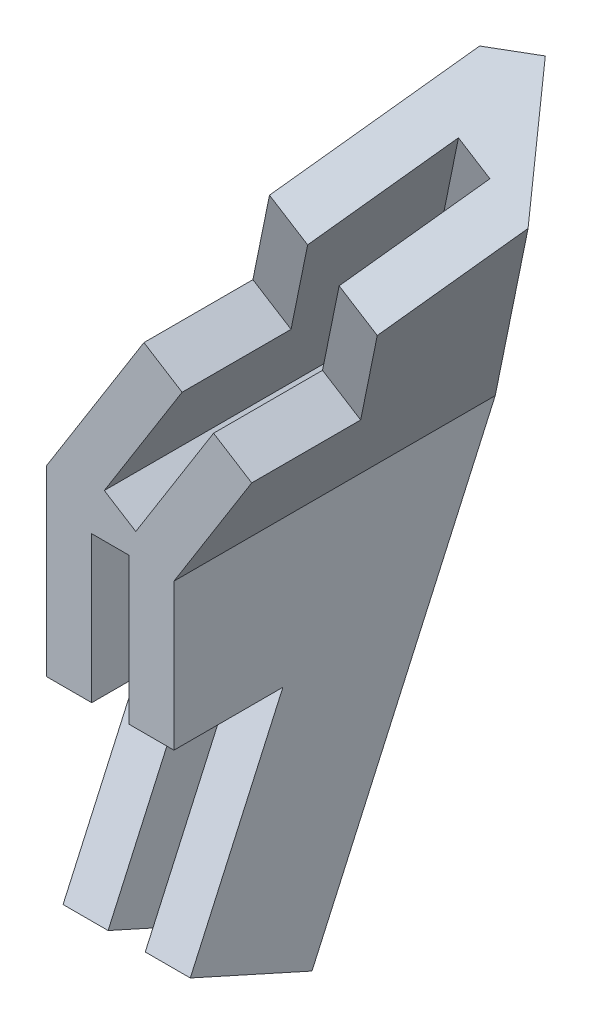
ISO-10303-21;
HEADER;
FILE_DESCRIPTION(('STEP AP214'),'2;1');
FILE_NAME('part.step','',(''),(''),'','','');
FILE_SCHEMA(('AUTOMOTIVE_DESIGN { 1 0 10303 214 1 1 1 1 }'));
ENDSEC;
DATA;
#1=APPLICATION_CONTEXT('core data for automotive mechanical design processes');
#2=APPLICATION_PROTOCOL_DEFINITION('international standard','automotive_design',2000,#1);
#3=PRODUCT_CONTEXT('',#1,'mechanical');
#4=PRODUCT('Part','Part','',(#3));
#5=PRODUCT_RELATED_PRODUCT_CATEGORY('part','',(#4));
#6=PRODUCT_DEFINITION_FORMATION('','',#4);
#7=PRODUCT_DEFINITION_CONTEXT('part definition',#1,'design');
#8=PRODUCT_DEFINITION('design','',#6,#7);
#9=PRODUCT_DEFINITION_SHAPE('','',#8);
#10=(LENGTH_UNIT() NAMED_UNIT(*) SI_UNIT(.MILLI.,.METRE.));
#11=(NAMED_UNIT(*) PLANE_ANGLE_UNIT() SI_UNIT($,.RADIAN.));
#12=(NAMED_UNIT(*) SI_UNIT($,.STERADIAN.) SOLID_ANGLE_UNIT());
#13=UNCERTAINTY_MEASURE_WITH_UNIT(LENGTH_MEASURE(1.E-05),#10,'distance_accuracy_value','');
#14=(GEOMETRIC_REPRESENTATION_CONTEXT(3) GLOBAL_UNCERTAINTY_ASSIGNED_CONTEXT((#13)) GLOBAL_UNIT_ASSIGNED_CONTEXT((#10,
#11,#12)) REPRESENTATION_CONTEXT('',''));
#15=CARTESIAN_POINT('',(0.,0.,0.));
#16=DIRECTION('',(0.,0.,1.));
#17=DIRECTION('',(1.,0.,0.));
#18=AXIS2_PLACEMENT_3D('',#15,#16,#17);
#19=CARTESIAN_POINT('',(-1.7,-15.,30.));
#20=DIRECTION('',(0.,1.,0.));
#21=DIRECTION('',(-1.,0.,0.));
#22=AXIS2_PLACEMENT_3D('',#19,#20,#21);
#23=PLANE('',#22);
#24=DIRECTION('',(-1.,0.,0.));
#25=VECTOR('',#24,1.);
#26=CARTESIAN_POINT('',(-1.7,-15.,20.3230812852325));
#27=LINE('',#26,#25);
#28=CARTESIAN_POINT('',(-1.7,-15.,20.3230812852325));
#29=VERTEX_POINT('',#28);
#30=CARTESIAN_POINT('',(-5.7,-15.,20.3230812852325));
#31=VERTEX_POINT('',#30);
#32=EDGE_CURVE('E376',#29,#31,#27,.T.);
#33=ORIENTED_EDGE('',*,*,#32,.F.);
#34=DIRECTION('',(0.,0.,-1.));
#35=VECTOR('',#34,1.);
#36=CARTESIAN_POINT('',(-1.7,-15.,30.));
#37=LINE('',#36,#35);
#38=CARTESIAN_POINT('',(-1.7,-15.,30.));
#39=VERTEX_POINT('',#38);
#40=EDGE_CURVE('E431',#39,#29,#37,.T.);
#41=ORIENTED_EDGE('',*,*,#40,.F.);
#42=DIRECTION('',(1.,0.,0.));
#43=VECTOR('',#42,1.);
#44=CARTESIAN_POINT('',(-1.7,-15.,30.));
#45=LINE('',#44,#43);
#46=CARTESIAN_POINT('',(-5.7,-15.,30.));
#47=VERTEX_POINT('',#46);
#48=EDGE_CURVE('E426',#47,#39,#45,.T.);
#49=ORIENTED_EDGE('',*,*,#48,.F.);
#50=DIRECTION('',(0.,0.,-1.));
#51=VECTOR('',#50,1.);
#52=CARTESIAN_POINT('',(-5.7,-15.,30.));
#53=LINE('',#52,#51);
#54=EDGE_CURVE('E435',#47,#31,#53,.T.);
#55=ORIENTED_EDGE('',*,*,#54,.T.);
#56=EDGE_LOOP('',(#33,#41,#49,#55));
#57=FACE_BOUND('',#56,.T.);
#58=ADVANCED_FACE('F39',(#57),#23,.F.);
#59=CARTESIAN_POINT('',(-9.,-15.,30.));
#60=DIRECTION('',(0.,1.,0.));
#61=DIRECTION('',(0.,0.,1.));
#62=AXIS2_PLACEMENT_3D('',#59,#60,#61);
#63=PLANE('',#62);
#64=DIRECTION('',(-1.,0.,0.));
#65=VECTOR('',#64,1.);
#66=CARTESIAN_POINT('',(-13.,-15.,20.3230812852325));
#67=LINE('',#66,#65);
#68=CARTESIAN_POINT('',(-9.,-15.,20.3230812852325));
#69=VERTEX_POINT('',#68);
#70=CARTESIAN_POINT('',(-13.,-15.,20.3230812852325));
#71=VERTEX_POINT('',#70);
#72=EDGE_CURVE('E386',#69,#71,#67,.T.);
#73=ORIENTED_EDGE('',*,*,#72,.F.);
#74=DIRECTION('',(0.,0.,-1.));
#75=VECTOR('',#74,1.);
#76=CARTESIAN_POINT('',(-9.,-15.,30.));
#77=LINE('',#76,#75);
#78=CARTESIAN_POINT('',(-9.,-15.,30.));
#79=VERTEX_POINT('',#78);
#80=EDGE_CURVE('E447',#79,#69,#77,.T.);
#81=ORIENTED_EDGE('',*,*,#80,.F.);
#82=DIRECTION('',(1.,0.,0.));
#83=VECTOR('',#82,1.);
#84=CARTESIAN_POINT('',(-9.,-15.,30.));
#85=LINE('',#84,#83);
#86=CARTESIAN_POINT('',(-13.,-15.,30.));
#87=VERTEX_POINT('',#86);
#88=EDGE_CURVE('E414',#87,#79,#85,.T.);
#89=ORIENTED_EDGE('',*,*,#88,.F.);
#90=DIRECTION('',(0.,0.,-1.));
#91=VECTOR('',#90,1.);
#92=CARTESIAN_POINT('',(-13.,-15.,30.));
#93=LINE('',#92,#91);
#94=EDGE_CURVE('E48',#87,#71,#93,.T.);
#95=ORIENTED_EDGE('',*,*,#94,.T.);
#96=EDGE_LOOP('',(#73,#81,#89,#95));
#97=FACE_BOUND('',#96,.T.);
#98=ADVANCED_FACE('F456',(#97),#63,.F.);
#99=CARTESIAN_POINT('',(-13.,-15.,30.));
#100=DIRECTION('',(1.,0.,0.));
#101=DIRECTION('',(0.,0.,-1.));
#102=AXIS2_PLACEMENT_3D('',#99,#100,#101);
#103=PLANE('',#102);
#104=DIRECTION('',(0.,0.,-1.));
#105=VECTOR('',#104,1.);
#106=CARTESIAN_POINT('',(-13.,1.25089745243292,30.));
#107=LINE('',#106,#105);
#108=CARTESIAN_POINT('',(-13.,1.25089745243292,30.));
#109=VERTEX_POINT('',#108);
#110=CARTESIAN_POINT('',(-13.,1.25089745243292,-5.11465509772061));
#111=VERTEX_POINT('',#110);
#112=EDGE_CURVE('E338',#109,#111,#107,.T.);
#113=ORIENTED_EDGE('',*,*,#112,.T.);
#114=DIRECTION('',(0.,-0.911707711386247,0.410839444307446));
#115=VECTOR('',#114,1.);
#116=CARTESIAN_POINT('',(-13.,8.19716535013695,-8.24482588322837));
#117=LINE('',#116,#115);
#118=CARTESIAN_POINT('',(-13.,-40.0344146004353,13.4895910329497));
#119=VERTEX_POINT('',#118);
#120=EDGE_CURVE('E347',#111,#119,#117,.T.);
#121=ORIENTED_EDGE('',*,*,#120,.T.);
#122=DIRECTION('',(0.,-0.410839444307446,-0.911707711386248));
#123=VECTOR('',#122,1.);
#124=CARTESIAN_POINT('',(-13.,-42.3512313415874,8.34826461445588));
#125=LINE('',#124,#123);
#126=CARTESIAN_POINT('',(-13.,-33.2492899463306,28.5466907237838));
#127=VERTEX_POINT('',#126);
#128=EDGE_CURVE('E351',#127,#119,#125,.T.);
#129=ORIENTED_EDGE('',*,*,#128,.F.);
#130=DIRECTION('',(0.,0.911707711386247,-0.410839444307446));
#131=VECTOR('',#130,1.);
#132=CARTESIAN_POINT('',(-13.,-42.3512313415874,32.6482646144559));
#133=LINE('',#132,#131);
#134=EDGE_CURVE('E390',#127,#71,#133,.T.);
#135=ORIENTED_EDGE('',*,*,#134,.T.);
#136=ORIENTED_EDGE('',*,*,#94,.F.);
#137=DIRECTION('',(0.,-1.,0.));
#138=VECTOR('',#137,1.);
#139=CARTESIAN_POINT('',(-13.,-15.,30.));
#140=LINE('',#139,#138);
#141=EDGE_CURVE('E411',#109,#87,#140,.T.);
#142=ORIENTED_EDGE('',*,*,#141,.F.);
#143=EDGE_LOOP('',(#113,#121,#129,#135,#136,#142));
#144=FACE_BOUND('',#143,.T.);
#145=ADVANCED_FACE('F41',(#144),#103,.F.);
#146=CARTESIAN_POINT('',(-9.00000000000004,-1.99999999999999,30.));
#147=DIRECTION('',(-1.,0.,0.));
#148=DIRECTION('',(0.,-1.,0.));
#149=AXIS2_PLACEMENT_3D('',#146,#147,#148);
#150=PLANE('',#149);
#151=DIRECTION('',(0.,0.911707711386247,-0.410839444307446));
#152=VECTOR('',#151,1.);
#153=CARTESIAN_POINT('',(-9.,-42.3512313415874,32.6482646144559));
#154=LINE('',#153,#152);
#155=CARTESIAN_POINT('',(-9.,-33.2492899463306,28.5466907237838));
#156=VERTEX_POINT('',#155);
#157=EDGE_CURVE('E393',#156,#69,#154,.T.);
#158=ORIENTED_EDGE('',*,*,#157,.F.);
#159=DIRECTION('',(0.,-0.410839444307446,-0.911707711386248));
#160=VECTOR('',#159,1.);
#161=CARTESIAN_POINT('',(-8.99999999999995,-27.430392513935,41.4596028951641));
#162=LINE('',#161,#160);
#163=CARTESIAN_POINT('',(-9.00000000000004,-38.1186413100483,17.7409483607689));
#164=VERTEX_POINT('',#163);
#165=EDGE_CURVE('E372',#156,#164,#162,.T.);
#166=ORIENTED_EDGE('',*,*,#165,.T.);
#167=DIRECTION('',(0.,0.911707711386248,-0.410839444307446));
#168=VECTOR('',#167,1.);
#169=CARTESIAN_POINT('',(-9.00000000000001,-12.6882487961132,6.28134546560477));
#170=LINE('',#169,#168);
#171=CARTESIAN_POINT('',(-9.00000000000004,-1.99999999999999,1.46493978955959));
#172=VERTEX_POINT('',#171);
#173=EDGE_CURVE('E408',#164,#172,#170,.T.);
#174=ORIENTED_EDGE('',*,*,#173,.T.);
#175=DIRECTION('',(0.,0.,-1.));
#176=VECTOR('',#175,1.);
#177=CARTESIAN_POINT('',(-9.00000000000004,-1.99999999999999,30.));
#178=LINE('',#177,#176);
#179=CARTESIAN_POINT('',(-9.00000000000004,-1.99999999999999,30.));
#180=VERTEX_POINT('',#179);
#181=EDGE_CURVE('E443',#180,#172,#178,.T.);
#182=ORIENTED_EDGE('',*,*,#181,.F.);
#183=DIRECTION('',(0.,1.,0.));
#184=VECTOR('',#183,1.);
#185=CARTESIAN_POINT('',(-9.00000000000004,-1.99999999999999,30.));
#186=LINE('',#185,#184);
#187=EDGE_CURVE('E417',#79,#180,#186,.T.);
#188=ORIENTED_EDGE('',*,*,#187,.F.);
#189=ORIENTED_EDGE('',*,*,#80,.T.);
#190=EDGE_LOOP('',(#158,#166,#174,#182,#188,#189));
#191=FACE_BOUND('',#190,.T.);
#192=ADVANCED_FACE('F467',(#191),#150,.F.);
#193=CARTESIAN_POINT('',(-5.7,-1.99999999999999,30.));
#194=DIRECTION('',(0.,1.,0.));
#195=DIRECTION('',(-1.,0.,0.));
#196=AXIS2_PLACEMENT_3D('',#193,#194,#195);
#197=PLANE('',#196);
#198=ORIENTED_EDGE('',*,*,#181,.T.);
#199=DIRECTION('',(1.,0.,0.));
#200=VECTOR('',#199,1.);
#201=CARTESIAN_POINT('',(-5.7,-1.99999999999999,1.46493978955959));
#202=LINE('',#201,#200);
#203=CARTESIAN_POINT('',(-5.7,-1.99999999999998,1.46493978955959));
#204=VERTEX_POINT('',#203);
#205=EDGE_CURVE('E404',#172,#204,#202,.T.);
#206=ORIENTED_EDGE('',*,*,#205,.T.);
#207=DIRECTION('',(0.,0.,-1.));
#208=VECTOR('',#207,1.);
#209=CARTESIAN_POINT('',(-5.7,-1.99999999999999,30.));
#210=LINE('',#209,#208);
#211=CARTESIAN_POINT('',(-5.7,-1.99999999999999,30.));
#212=VERTEX_POINT('',#211);
#213=EDGE_CURVE('E439',#212,#204,#210,.T.);
#214=ORIENTED_EDGE('',*,*,#213,.F.);
#215=DIRECTION('',(1.,0.,0.));
#216=VECTOR('',#215,1.);
#217=CARTESIAN_POINT('',(-5.7,-1.99999999999999,30.));
#218=LINE('',#217,#216);
#219=EDGE_CURVE('E420',#180,#212,#218,.T.);
#220=ORIENTED_EDGE('',*,*,#219,.F.);
#221=EDGE_LOOP('',(#198,#206,#214,#220));
#222=FACE_BOUND('',#221,.T.);
#223=ADVANCED_FACE('F533',(#222),#197,.F.);
#224=CARTESIAN_POINT('',(-5.7,-15.,30.));
#225=DIRECTION('',(1.,0.,0.));
#226=DIRECTION('',(0.,0.,-1.));
#227=AXIS2_PLACEMENT_3D('',#224,#225,#226);
#228=PLANE('',#227);
#229=DIRECTION('',(0.,-0.911707711386248,0.410839444307446));
#230=VECTOR('',#229,1.);
#231=CARTESIAN_POINT('',(-5.7,-23.4939911591282,11.1506968293224));
#232=LINE('',#231,#230);
#233=CARTESIAN_POINT('',(-5.7,-38.1186413100483,17.7409483607689));
#234=VERTEX_POINT('',#233);
#235=EDGE_CURVE('E400',#204,#234,#232,.T.);
#236=ORIENTED_EDGE('',*,*,#235,.T.);
#237=DIRECTION('',(0.,0.410839444307446,0.911707711386248));
#238=VECTOR('',#237,1.);
#239=CARTESIAN_POINT('',(-5.7,-29.6246501509201,36.5902515314465));
#240=LINE('',#239,#238);
#241=CARTESIAN_POINT('',(-5.7,-33.2492899463306,28.5466907237838));
#242=VERTEX_POINT('',#241);
#243=EDGE_CURVE('E368',#234,#242,#240,.T.);
#244=ORIENTED_EDGE('',*,*,#243,.T.);
#245=DIRECTION('',(0.,0.911707711386247,-0.410839444307446));
#246=VECTOR('',#245,1.);
#247=CARTESIAN_POINT('',(-5.7,-42.3512313415874,32.6482646144559));
#248=LINE('',#247,#246);
#249=EDGE_CURVE('E380',#242,#31,#248,.T.);
#250=ORIENTED_EDGE('',*,*,#249,.T.);
#251=ORIENTED_EDGE('',*,*,#54,.F.);
#252=DIRECTION('',(0.,-1.,0.));
#253=VECTOR('',#252,1.);
#254=CARTESIAN_POINT('',(-5.7,-15.,30.));
#255=LINE('',#254,#253);
#256=EDGE_CURVE('E423',#212,#47,#255,.T.);
#257=ORIENTED_EDGE('',*,*,#256,.F.);
#258=ORIENTED_EDGE('',*,*,#213,.T.);
#259=EDGE_LOOP('',(#236,#244,#250,#251,#257,#258));
#260=FACE_BOUND('',#259,.T.);
#261=ADVANCED_FACE('F525',(#260),#228,.F.);
#262=CARTESIAN_POINT('',(-1.7,-2.,30.));
#263=DIRECTION('',(-1.,0.,0.));
#264=DIRECTION('',(0.,0.,1.));
#265=AXIS2_PLACEMENT_3D('',#262,#263,#264);
#266=PLANE('',#265);
#267=DIRECTION('',(0.,0.911707711386247,-0.410839444307446));
#268=VECTOR('',#267,1.);
#269=CARTESIAN_POINT('',(-1.7,-42.3512313415874,32.6482646144559));
#270=LINE('',#269,#268);
#271=CARTESIAN_POINT('',(-1.7,-33.2492899463306,28.5466907237838));
#272=VERTEX_POINT('',#271);
#273=EDGE_CURVE('E383',#272,#29,#270,.T.);
#274=ORIENTED_EDGE('',*,*,#273,.F.);
#275=DIRECTION('',(0.,-0.410839444307446,-0.911707711386248));
#276=VECTOR('',#275,1.);
#277=CARTESIAN_POINT('',(-1.7,-42.3512313415874,8.34826461445588));
#278=LINE('',#277,#276);
#279=CARTESIAN_POINT('',(-1.7,-38.1186413100482,17.7409483607689));
#280=VERTEX_POINT('',#279);
#281=EDGE_CURVE('E354',#272,#280,#278,.T.);
#282=ORIENTED_EDGE('',*,*,#281,.T.);
#283=DIRECTION('',(0.,0.911707711386248,-0.410839444307446));
#284=VECTOR('',#283,1.);
#285=CARTESIAN_POINT('',(-1.7,1.25089745243292,0.));
#286=LINE('',#285,#284);
#287=CARTESIAN_POINT('',(-1.7,-2.00000000000001,1.4649397895596));
#288=VERTEX_POINT('',#287);
#289=EDGE_CURVE('E396',#280,#288,#286,.T.);
#290=ORIENTED_EDGE('',*,*,#289,.T.);
#291=DIRECTION('',(0.,0.,-1.));
#292=VECTOR('',#291,1.);
#293=CARTESIAN_POINT('',(-1.7,-2.00000000000001,30.));
#294=LINE('',#293,#292);
#295=CARTESIAN_POINT('',(-1.7,-2.,30.));
#296=VERTEX_POINT('',#295);
#297=EDGE_CURVE('E311',#296,#288,#294,.T.);
#298=ORIENTED_EDGE('',*,*,#297,.F.);
#299=DIRECTION('',(0.,1.,0.));
#300=VECTOR('',#299,1.);
#301=CARTESIAN_POINT('',(-1.7,-2.,30.));
#302=LINE('',#301,#300);
#303=EDGE_CURVE('E63',#39,#296,#302,.T.);
#304=ORIENTED_EDGE('',*,*,#303,.F.);
#305=ORIENTED_EDGE('',*,*,#40,.T.);
#306=EDGE_LOOP('',(#274,#282,#290,#298,#304,#305));
#307=FACE_BOUND('',#306,.T.);
#308=ADVANCED_FACE('F517',(#307),#266,.F.);
#309=CARTESIAN_POINT('',(0.,0.,30.));
#310=DIRECTION('',(0.,0.,-1.));
#311=DIRECTION('',(-1.,0.,0.));
#312=AXIS2_PLACEMENT_3D('',#309,#310,#311);
#313=PLANE('',#312);
#314=ORIENTED_EDGE('',*,*,#303,.T.);
#315=DIRECTION('',(-0.531398579518072,-0.847121921382144,0.));
#316=VECTOR('',#315,1.);
#317=CARTESIAN_POINT('',(-1.7,-2.00000000000001,30.));
#318=LINE('',#317,#316);
#319=CARTESIAN_POINT('',(5.20818153373493,9.01258497796785,30.));
#320=VERTEX_POINT('',#319);
#321=EDGE_CURVE('E307',#320,#296,#318,.T.);
#322=ORIENTED_EDGE('',*,*,#321,.F.);
#323=DIRECTION('',(0.847121921382144,-0.531398579518072,0.));
#324=VECTOR('',#323,1.);
#325=CARTESIAN_POINT('',(5.20818153373493,9.01258497796785,30.));
#326=LINE('',#325,#324);
#327=CARTESIAN_POINT('',(1.81969384820635,11.1381792960401,30.));
#328=VERTEX_POINT('',#327);
#329=EDGE_CURVE('E303',#328,#320,#326,.T.);
#330=ORIENTED_EDGE('',*,*,#329,.F.);
#331=DIRECTION('',(0.531398579518072,0.847121921382144,0.));
#332=VECTOR('',#331,1.);
#333=CARTESIAN_POINT('',(1.81969384820635,11.1381792960401,30.));
#334=LINE('',#333,#332);
#335=CARTESIAN_POINT('',(-5.08848768552858,0.12559431807227,30.));
#336=VERTEX_POINT('',#335);
#337=EDGE_CURVE('E300',#336,#328,#334,.T.);
#338=ORIENTED_EDGE('',*,*,#337,.F.);
#339=DIRECTION('',(0.847121921382144,-0.531398579518072,0.));
#340=VECTOR('',#339,1.);
#341=CARTESIAN_POINT('',(-5.08848768552858,0.12559431807227,30.));
#342=LINE('',#341,#340);
#343=CARTESIAN_POINT('',(-7.88399002608969,1.87920963048193,30.));
#344=VERTEX_POINT('',#343);
#345=EDGE_CURVE('E296',#344,#336,#342,.T.);
#346=ORIENTED_EDGE('',*,*,#345,.F.);
#347=DIRECTION('',(-0.531398579518075,-0.847121921382142,0.));
#348=VECTOR('',#347,1.);
#349=CARTESIAN_POINT('',(-7.88399002608969,1.87920963048193,30.));
#350=LINE('',#349,#348);
#351=CARTESIAN_POINT('',(-0.97580849235472,12.8917946084498,30.));
#352=VERTEX_POINT('',#351);
#353=EDGE_CURVE('E292',#352,#344,#350,.T.);
#354=ORIENTED_EDGE('',*,*,#353,.F.);
#355=DIRECTION('',(0.847121921382144,-0.531398579518072,0.));
#356=VECTOR('',#355,1.);
#357=CARTESIAN_POINT('',(-0.97580849235472,12.8917946084498,30.));
#358=LINE('',#357,#356);
#359=CARTESIAN_POINT('',(-4.3642961778833,15.0173889265221,30.));
#360=VERTEX_POINT('',#359);
#361=EDGE_CURVE('E288',#360,#352,#358,.T.);
#362=ORIENTED_EDGE('',*,*,#361,.F.);
#363=DIRECTION('',(0.531398579518072,0.847121921382144,0.));
#364=VECTOR('',#363,1.);
#365=CARTESIAN_POINT('',(-4.3642961778833,15.0173889265221,30.));
#366=LINE('',#365,#364);
#367=EDGE_CURVE('E285',#109,#360,#366,.T.);
#368=ORIENTED_EDGE('',*,*,#367,.F.);
#369=ORIENTED_EDGE('',*,*,#141,.T.);
#370=ORIENTED_EDGE('',*,*,#88,.T.);
#371=ORIENTED_EDGE('',*,*,#187,.T.);
#372=ORIENTED_EDGE('',*,*,#219,.T.);
#373=ORIENTED_EDGE('',*,*,#256,.T.);
#374=ORIENTED_EDGE('',*,*,#48,.T.);
#375=EDGE_LOOP('',(#314,#322,#330,#338,#346,#354,#362,#368,#369,#370,#371,#372,#373,#374));
#376=FACE_BOUND('',#375,.T.);
#377=ADVANCED_FACE('F472',(#376),#313,.F.);
#378=CARTESIAN_POINT('',(-13.,-42.3512313415874,32.6482646144559));
#379=DIRECTION('',(0.,-0.410839444307446,-0.911707711386247));
#380=DIRECTION('',(0.,0.911707711386248,-0.410839444307446));
#381=AXIS2_PLACEMENT_3D('',#378,#379,#380);
#382=PLANE('',#381);
#383=ORIENTED_EDGE('',*,*,#134,.F.);
#384=DIRECTION('',(-1.,0.,0.));
#385=VECTOR('',#384,1.);
#386=CARTESIAN_POINT('',(-1.7,-33.2492899463306,28.5466907237838));
#387=LINE('',#386,#385);
#388=EDGE_CURVE('E358',#156,#127,#387,.T.);
#389=ORIENTED_EDGE('',*,*,#388,.F.);
#390=ORIENTED_EDGE('',*,*,#157,.T.);
#391=ORIENTED_EDGE('',*,*,#72,.T.);
#392=EDGE_LOOP('',(#383,#389,#390,#391));
#393=FACE_BOUND('',#392,.T.);
#394=ADVANCED_FACE('F464',(#393),#382,.F.);
#395=CARTESIAN_POINT('',(-1.7,-42.3512313415874,32.6482646144559));
#396=DIRECTION('',(0.,-0.410839444307446,-0.911707711386247));
#397=DIRECTION('',(0.,0.911707711386248,-0.410839444307446));
#398=AXIS2_PLACEMENT_3D('',#395,#396,#397);
#399=PLANE('',#398);
#400=ORIENTED_EDGE('',*,*,#249,.F.);
#401=EDGE_CURVE('E362',#272,#242,#387,.T.);
#402=ORIENTED_EDGE('',*,*,#401,.F.);
#403=ORIENTED_EDGE('',*,*,#273,.T.);
#404=ORIENTED_EDGE('',*,*,#32,.T.);
#405=EDGE_LOOP('',(#400,#402,#403,#404));
#406=FACE_BOUND('',#405,.T.);
#407=ADVANCED_FACE('F521',(#406),#399,.F.);
#408=CARTESIAN_POINT('',(-1.7,15.2246680695878,-6.2969481156439));
#409=DIRECTION('',(0.,0.410839444307446,0.911707711386248));
#410=DIRECTION('',(0.,-0.911707711386247,0.410839444307446));
#411=AXIS2_PLACEMENT_3D('',#408,#409,#410);
#412=PLANE('',#411);
#413=DIRECTION('',(-1.,0.,0.));
#414=VECTOR('',#413,1.);
#415=CARTESIAN_POINT('',(-1.7,-38.1186413100483,17.7409483607689));
#416=LINE('',#415,#414);
#417=EDGE_CURVE('E365',#234,#164,#416,.T.);
#418=ORIENTED_EDGE('',*,*,#417,.F.);
#419=ORIENTED_EDGE('',*,*,#235,.F.);
#420=ORIENTED_EDGE('',*,*,#205,.F.);
#421=ORIENTED_EDGE('',*,*,#173,.F.);
#422=EDGE_LOOP('',(#418,#419,#420,#421));
#423=FACE_BOUND('',#422,.T.);
#424=ADVANCED_FACE('F530',(#423),#412,.T.);
#425=CARTESIAN_POINT('',(-1.7,15.2246680695878,-6.2969481156439));
#426=DIRECTION('',(0.673730858796115,-0.303600823140683,-0.673730858796113));
#427=DIRECTION('',(-0.707106781186546,0.,-0.707106781186549));
#428=AXIS2_PLACEMENT_3D('',#425,#426,#427);
#429=PLANE('',#428);
#430=DIRECTION('',(0.,-0.911707711386247,0.410839444307446));
#431=VECTOR('',#430,1.);
#432=CARTESIAN_POINT('',(-10.0504379850208,6.98515274898547,-10.9344440542144));
#433=LINE('',#432,#431);
#434=CARTESIAN_POINT('',(-10.0504379850208,0.402337838248064,-7.96805473214323));
#435=VERTEX_POINT('',#434);
#436=CARTESIAN_POINT('',(-10.0504379850208,-41.2464272015867,10.7999728619636));
#437=VERTEX_POINT('',#436);
#438=EDGE_CURVE('E55',#435,#437,#433,.T.);
#439=ORIENTED_EDGE('',*,*,#438,.F.);
#440=DIRECTION('',(-0.651102708453991,0.187315764264182,-0.735512112410124));
#441=VECTOR('',#440,1.);
#442=CARTESIAN_POINT('',(-7.51787253854932,-0.326256016446955,-5.1071657553886));
#443=LINE('',#442,#441);
#444=EDGE_CURVE('E246',#288,#435,#443,.T.);
#445=ORIENTED_EDGE('',*,*,#444,.F.);
#446=ORIENTED_EDGE('',*,*,#289,.F.);
#447=DIRECTION('',(0.738976812833697,0.276795211640574,0.614245619363298));
#448=VECTOR('',#447,1.);
#449=CARTESIAN_POINT('',(-1.7,-38.1186413100483,17.7409483607689));
#450=LINE('',#449,#448);
#451=EDGE_CURVE('E11',#437,#280,#450,.T.);
#452=ORIENTED_EDGE('',*,*,#451,.F.);
#453=EDGE_LOOP('',(#439,#445,#446,#452));
#454=FACE_BOUND('',#453,.T.);
#455=ADVANCED_FACE('F514',(#454),#429,.T.);
#456=CARTESIAN_POINT('',(-1.7,-42.3512313415874,8.34826461445588));
#457=DIRECTION('',(0.,0.911707711386247,-0.410839444307446));
#458=DIRECTION('',(0.,0.410839444307446,0.911707711386248));
#459=AXIS2_PLACEMENT_3D('',#456,#457,#458);
#460=PLANE('',#459);
#461=ORIENTED_EDGE('',*,*,#128,.T.);
#462=DIRECTION('',(-0.707043710808464,0.290533266536796,0.644732201802932));
#463=VECTOR('',#462,1.);
#464=CARTESIAN_POINT('',(-8.57573568978878,-41.8524011582933,9.45523555184516));
#465=LINE('',#464,#463);
#466=EDGE_CURVE('E344',#437,#119,#465,.T.);
#467=ORIENTED_EDGE('',*,*,#466,.F.);
#468=ORIENTED_EDGE('',*,*,#451,.T.);
#469=ORIENTED_EDGE('',*,*,#281,.F.);
#470=ORIENTED_EDGE('',*,*,#401,.T.);
#471=ORIENTED_EDGE('',*,*,#243,.F.);
#472=ORIENTED_EDGE('',*,*,#417,.T.);
#473=ORIENTED_EDGE('',*,*,#165,.F.);
#474=ORIENTED_EDGE('',*,*,#388,.T.);
#475=EDGE_LOOP('',(#461,#467,#468,#469,#470,#471,#472,#473,#474));
#476=FACE_BOUND('',#475,.T.);
#477=ADVANCED_FACE('F477',(#476),#460,.F.);
#478=CARTESIAN_POINT('',(-8.57573568978878,6.37917879227894,-12.2791813643329));
#479=DIRECTION('',(0.707169845939572,0.290481445249624,0.644617203431224));
#480=DIRECTION('',(0.67366522717444,0.,-0.73903664435264));
#481=AXIS2_PLACEMENT_3D('',#478,#479,#480);
#482=PLANE('',#481);
#483=DIRECTION('',(0.703837316885534,-0.202486985875257,-0.680890631386955));
#484=VECTOR('',#483,1.);
#485=CARTESIAN_POINT('',(-8.10564839167238,-0.15715875772843,-9.84943979423298));
#486=LINE('',#485,#484);
#487=EDGE_CURVE('E215',#111,#435,#486,.T.);
#488=ORIENTED_EDGE('',*,*,#487,.T.);
#489=ORIENTED_EDGE('',*,*,#438,.T.);
#490=ORIENTED_EDGE('',*,*,#466,.T.);
#491=ORIENTED_EDGE('',*,*,#120,.F.);
#492=EDGE_LOOP('',(#488,#489,#490,#491));
#493=FACE_BOUND('',#492,.T.);
#494=ADVANCED_FACE('F621',(#493),#482,.F.);
#495=CARTESIAN_POINT('',(5.20818153373493,9.01258497796785,30.));
#496=DIRECTION('',(-0.531398579518072,-0.847121921382144,0.));
#497=DIRECTION('',(-0.847121921382144,0.531398579518072,0.));
#498=AXIS2_PLACEMENT_3D('',#495,#496,#497);
#499=PLANE('',#498);
#500=DIRECTION('',(-0.847121921382144,0.531398579518072,0.));
#501=VECTOR('',#500,1.);
#502=CARTESIAN_POINT('',(5.20818153373493,9.01258497796785,20.3230812852325));
#503=LINE('',#502,#501);
#504=CARTESIAN_POINT('',(5.20818153373493,9.01258497796785,20.3230812852325));
#505=VERTEX_POINT('',#504);
#506=CARTESIAN_POINT('',(1.81969384820635,11.1381792960401,20.3230812852325));
#507=VERTEX_POINT('',#506);
#508=EDGE_CURVE('E250',#505,#507,#503,.T.);
#509=ORIENTED_EDGE('',*,*,#508,.T.);
#510=DIRECTION('',(0.,0.,-1.));
#511=VECTOR('',#510,1.);
#512=CARTESIAN_POINT('',(1.81969384820635,11.1381792960401,30.));
#513=LINE('',#512,#511);
#514=EDGE_CURVE('E319',#328,#507,#513,.T.);
#515=ORIENTED_EDGE('',*,*,#514,.F.);
#516=ORIENTED_EDGE('',*,*,#329,.T.);
#517=DIRECTION('',(0.,0.,-1.));
#518=VECTOR('',#517,1.);
#519=CARTESIAN_POINT('',(5.20818153373493,9.01258497796785,30.));
#520=LINE('',#519,#518);
#521=EDGE_CURVE('E315',#320,#505,#520,.T.);
#522=ORIENTED_EDGE('',*,*,#521,.T.);
#523=EDGE_LOOP('',(#509,#515,#516,#522));
#524=FACE_BOUND('',#523,.T.);
#525=ADVANCED_FACE('F629',(#524),#499,.F.);
#526=CARTESIAN_POINT('',(-0.97580849235472,12.8917946084498,30.));
#527=DIRECTION('',(-0.531398579518072,-0.847121921382144,0.));
#528=DIRECTION('',(0.,0.,1.));
#529=AXIS2_PLACEMENT_3D('',#526,#527,#528);
#530=PLANE('',#529);
#531=DIRECTION('',(-0.847121921382144,0.531398579518072,0.));
#532=VECTOR('',#531,1.);
#533=CARTESIAN_POINT('',(-4.3642961778833,15.0173889265221,20.3230812852325));
#534=LINE('',#533,#532);
#535=CARTESIAN_POINT('',(-0.97580849235472,12.8917946084498,20.3230812852325));
#536=VERTEX_POINT('',#535);
#537=CARTESIAN_POINT('',(-4.3642961778833,15.0173889265221,20.3230812852325));
#538=VERTEX_POINT('',#537);
#539=EDGE_CURVE('E260',#536,#538,#534,.T.);
#540=ORIENTED_EDGE('',*,*,#539,.T.);
#541=DIRECTION('',(0.,0.,-1.));
#542=VECTOR('',#541,1.);
#543=CARTESIAN_POINT('',(-4.3642961778833,15.0173889265221,30.));
#544=LINE('',#543,#542);
#545=EDGE_CURVE('E335',#360,#538,#544,.T.);
#546=ORIENTED_EDGE('',*,*,#545,.F.);
#547=ORIENTED_EDGE('',*,*,#361,.T.);
#548=DIRECTION('',(0.,0.,-1.));
#549=VECTOR('',#548,1.);
#550=CARTESIAN_POINT('',(-0.97580849235472,12.8917946084498,30.));
#551=LINE('',#550,#549);
#552=EDGE_CURVE('E331',#352,#536,#551,.T.);
#553=ORIENTED_EDGE('',*,*,#552,.T.);
#554=EDGE_LOOP('',(#540,#546,#547,#553));
#555=FACE_BOUND('',#554,.T.);
#556=ADVANCED_FACE('F644',(#555),#530,.F.);
#557=CARTESIAN_POINT('',(-4.3642961778833,15.0173889265221,30.));
#558=DIRECTION('',(0.847121921382144,-0.531398579518072,0.));
#559=DIRECTION('',(0.,0.,-1.));
#560=AXIS2_PLACEMENT_3D('',#557,#558,#559);
#561=PLANE('',#560);
#562=ORIENTED_EDGE('',*,*,#112,.F.);
#563=ORIENTED_EDGE('',*,*,#367,.T.);
#564=ORIENTED_EDGE('',*,*,#545,.T.);
#565=DIRECTION('',(-0.484480182766324,-0.772327588208435,-0.410839444307446));
#566=VECTOR('',#565,1.);
#567=CARTESIAN_POINT('',(10.1701093051064,38.1872165727751,32.6482646144559));
#568=LINE('',#567,#566);
#569=CARTESIAN_POINT('',(5.33335057681025,30.4767624897175,28.5466907237838));
#570=VERTEX_POINT('',#569);
#571=EDGE_CURVE('E222',#570,#538,#568,.T.);
#572=ORIENTED_EDGE('',*,*,#571,.F.);
#573=DIRECTION('',(0.218319497114971,0.348031099441296,-0.911707711386248));
#574=VECTOR('',#573,1.);
#575=CARTESIAN_POINT('',(10.1701093051064,38.1872165727751,8.34826461445588));
#576=LINE('',#575,#574);
#577=CARTESIAN_POINT('',(8.93895617985451,36.22459032352,13.4895910329497));
#578=VERTEX_POINT('',#577);
#579=EDGE_CURVE('E201',#570,#578,#576,.T.);
#580=ORIENTED_EDGE('',*,*,#579,.T.);
#581=DIRECTION('',(0.484480182766324,0.772327588208435,0.410839444307446));
#582=VECTOR('',#581,1.);
#583=CARTESIAN_POINT('',(-16.6912368937919,-4.63343835550523,-8.24482588322837));
#584=LINE('',#583,#582);
#585=EDGE_CURVE('E213',#111,#578,#584,.T.);
#586=ORIENTED_EDGE('',*,*,#585,.F.);
#587=EDGE_LOOP('',(#562,#563,#564,#572,#580,#586));
#588=FACE_BOUND('',#587,.T.);
#589=ADVANCED_FACE('F220',(#588),#561,.F.);
#590=CARTESIAN_POINT('',(-7.88399002608969,1.87920963048193,30.));
#591=DIRECTION('',(-0.847121921382142,0.531398579518075,0.));
#592=DIRECTION('',(0.531398579518075,0.847121921382142,0.));
#593=AXIS2_PLACEMENT_3D('',#590,#591,#592);
#594=PLANE('',#593);
#595=DIRECTION('',(-0.484480182766324,-0.772327588208435,-0.410839444307446));
#596=VECTOR('',#595,1.);
#597=CARTESIAN_POINT('',(13.558596990635,36.0616222547028,32.6482646144559));
#598=LINE('',#597,#596);
#599=CARTESIAN_POINT('',(8.72183826233882,28.3511681716452,28.5466907237838));
#600=VERTEX_POINT('',#599);
#601=EDGE_CURVE('E266',#600,#536,#598,.T.);
#602=ORIENTED_EDGE('',*,*,#601,.T.);
#603=ORIENTED_EDGE('',*,*,#552,.F.);
#604=ORIENTED_EDGE('',*,*,#353,.T.);
#605=DIRECTION('',(0.,0.,-1.));
#606=VECTOR('',#605,1.);
#607=CARTESIAN_POINT('',(-7.88399002608969,1.87920963048193,30.));
#608=LINE('',#607,#606);
#609=CARTESIAN_POINT('',(-7.88399002608969,1.87920963048193,1.46493978955959));
#610=VERTEX_POINT('',#609);
#611=EDGE_CURVE('E327',#344,#610,#608,.T.);
#612=ORIENTED_EDGE('',*,*,#611,.T.);
#613=DIRECTION('',(-0.484480182766327,-0.772327588208434,-0.410839444307446));
#614=VECTOR('',#613,1.);
#615=CARTESIAN_POINT('',(-2.20426979829935,10.9334594868557,6.28134546560477));
#616=LINE('',#615,#614);
#617=CARTESIAN_POINT('',(11.3094046601927,32.4761024547625,17.7409483607689));
#618=VERTEX_POINT('',#617);
#619=EDGE_CURVE('E281',#618,#610,#616,.T.);
#620=ORIENTED_EDGE('',*,*,#619,.F.);
#621=DIRECTION('',(0.218319497114972,0.348031099441295,-0.911707711386248));
#622=VECTOR('',#621,1.);
#623=CARTESIAN_POINT('',(5.62968443240247,23.4218525983886,41.4596028951641));
#624=LINE('',#623,#622);
#625=EDGE_CURVE('E242',#600,#618,#624,.T.);
#626=ORIENTED_EDGE('',*,*,#625,.F.);
#627=EDGE_LOOP('',(#602,#603,#604,#612,#620,#626));
#628=FACE_BOUND('',#627,.T.);
#629=ADVANCED_FACE('F488',(#628),#594,.F.);
#630=CARTESIAN_POINT('',(-5.08848768552858,0.12559431807227,30.));
#631=DIRECTION('',(-0.531398579518072,-0.847121921382144,0.));
#632=DIRECTION('',(-0.847121921382144,0.531398579518072,0.));
#633=AXIS2_PLACEMENT_3D('',#630,#631,#632);
#634=PLANE('',#633);
#635=ORIENTED_EDGE('',*,*,#611,.F.);
#636=ORIENTED_EDGE('',*,*,#345,.T.);
#637=DIRECTION('',(0.,0.,-1.));
#638=VECTOR('',#637,1.);
#639=CARTESIAN_POINT('',(-5.08848768552858,0.12559431807227,30.));
#640=LINE('',#639,#638);
#641=CARTESIAN_POINT('',(-5.08848768552859,0.125594318072269,1.46493978955959));
#642=VERTEX_POINT('',#641);
#643=EDGE_CURVE('E323',#336,#642,#640,.T.);
#644=ORIENTED_EDGE('',*,*,#643,.T.);
#645=DIRECTION('',(0.847121921382144,-0.531398579518072,0.));
#646=VECTOR('',#645,1.);
#647=CARTESIAN_POINT('',(-5.08848768552859,0.125594318072271,1.46493978955959));
#648=LINE('',#647,#646);
#649=EDGE_CURVE('E277',#610,#642,#648,.T.);
#650=ORIENTED_EDGE('',*,*,#649,.F.);
#651=EDGE_LOOP('',(#635,#636,#644,#650));
#652=FACE_BOUND('',#651,.T.);
#653=ADVANCED_FACE('F674',(#652),#634,.F.);
#654=CARTESIAN_POINT('',(1.81969384820635,11.1381792960401,30.));
#655=DIRECTION('',(0.847121921382144,-0.531398579518072,0.));
#656=DIRECTION('',(0.,0.,-1.));
#657=AXIS2_PLACEMENT_3D('',#654,#655,#656);
#658=PLANE('',#657);
#659=DIRECTION('',(0.484480182766324,0.772327588208435,0.410839444307446));
#660=VECTOR('',#659,1.);
#661=CARTESIAN_POINT('',(6.33338868460613,18.3336254069637,11.1506968293224));
#662=LINE('',#661,#660);
#663=CARTESIAN_POINT('',(14.1049070007538,30.7224871423528,17.7409483607689));
#664=VERTEX_POINT('',#663);
#665=EDGE_CURVE('E273',#642,#664,#662,.T.);
#666=ORIENTED_EDGE('',*,*,#665,.F.);
#667=ORIENTED_EDGE('',*,*,#643,.F.);
#668=ORIENTED_EDGE('',*,*,#337,.T.);
#669=ORIENTED_EDGE('',*,*,#514,.T.);
#670=DIRECTION('',(-0.484480182766324,-0.772327588208435,-0.410839444307446));
#671=VECTOR('',#670,1.);
#672=CARTESIAN_POINT('',(16.3540993311961,34.3080069422932,32.6482646144559));
#673=LINE('',#672,#671);
#674=CARTESIAN_POINT('',(11.5173406028999,26.5975528592356,28.5466907237838));
#675=VERTEX_POINT('',#674);
#676=EDGE_CURVE('E254',#675,#507,#673,.T.);
#677=ORIENTED_EDGE('',*,*,#676,.F.);
#678=DIRECTION('',(-0.218319497114971,-0.348031099441296,0.911707711386248));
#679=VECTOR('',#678,1.);
#680=CARTESIAN_POINT('',(9.59121216435405,23.5270410314292,36.5902515314465));
#681=LINE('',#680,#679);
#682=EDGE_CURVE('E238',#664,#675,#681,.T.);
#683=ORIENTED_EDGE('',*,*,#682,.F.);
#684=EDGE_LOOP('',(#666,#667,#668,#669,#677,#683));
#685=FACE_BOUND('',#684,.T.);
#686=ADVANCED_FACE('F496',(#685),#658,.F.);
#687=CARTESIAN_POINT('',(-1.7,-2.00000000000001,30.));
#688=DIRECTION('',(-0.847121921382144,0.531398579518072,0.));
#689=DIRECTION('',(0.,0.,1.));
#690=AXIS2_PLACEMENT_3D('',#687,#688,#689);
#691=PLANE('',#690);
#692=DIRECTION('',(-0.484480182766324,-0.772327588208435,-0.410839444307446));
#693=VECTOR('',#692,1.);
#694=CARTESIAN_POINT('',(19.7425870167247,32.1824126242209,32.6482646144559));
#695=LINE('',#694,#693);
#696=CARTESIAN_POINT('',(14.9058282884285,24.4719585411633,28.5466907237838));
#697=VERTEX_POINT('',#696);
#698=EDGE_CURVE('E257',#697,#505,#695,.T.);
#699=ORIENTED_EDGE('',*,*,#698,.T.);
#700=ORIENTED_EDGE('',*,*,#521,.F.);
#701=ORIENTED_EDGE('',*,*,#321,.T.);
#702=ORIENTED_EDGE('',*,*,#297,.T.);
#703=DIRECTION('',(-0.484480182766324,-0.772327588208435,-0.410839444307446));
#704=VECTOR('',#703,1.);
#705=CARTESIAN_POINT('',(-3.42752228838177,-4.7539064961213,0.));
#706=LINE('',#705,#704);
#707=CARTESIAN_POINT('',(17.4933946862824,28.5968928242805,17.7409483607689));
#708=VERTEX_POINT('',#707);
#709=EDGE_CURVE('E269',#708,#288,#706,.T.);
#710=ORIENTED_EDGE('',*,*,#709,.F.);
#711=DIRECTION('',(0.218319497114971,0.348031099441296,-0.911707711386248));
#712=VECTOR('',#711,1.);
#713=CARTESIAN_POINT('',(19.7425870167247,32.1824126242209,8.34826461445588));
#714=LINE('',#713,#712);
#715=EDGE_CURVE('E224',#697,#708,#714,.T.);
#716=ORIENTED_EDGE('',*,*,#715,.F.);
#717=EDGE_LOOP('',(#699,#700,#701,#702,#710,#716));
#718=FACE_BOUND('',#717,.T.);
#719=ADVANCED_FACE('F506',(#718),#691,.F.);
#720=CARTESIAN_POINT('',(10.1701093051064,38.1872165727751,32.6482646144559));
#721=DIRECTION('',(0.218319497114971,0.348031099441296,-0.911707711386247));
#722=DIRECTION('',(-0.484480182766324,-0.772327588208435,-0.410839444307446));
#723=AXIS2_PLACEMENT_3D('',#720,#721,#722);
#724=PLANE('',#723);
#725=ORIENTED_EDGE('',*,*,#571,.T.);
#726=ORIENTED_EDGE('',*,*,#539,.F.);
#727=ORIENTED_EDGE('',*,*,#601,.F.);
#728=DIRECTION('',(-0.847121921382144,0.531398579518072,0.));
#729=VECTOR('',#728,1.);
#730=CARTESIAN_POINT('',(14.9058282884285,24.4719585411633,28.5466907237838));
#731=LINE('',#730,#729);
#732=EDGE_CURVE('E228',#600,#570,#731,.T.);
#733=ORIENTED_EDGE('',*,*,#732,.T.);
#734=EDGE_LOOP('',(#725,#726,#727,#733));
#735=FACE_BOUND('',#734,.T.);
#736=ADVANCED_FACE('F483',(#735),#724,.F.);
#737=CARTESIAN_POINT('',(19.7425870167247,32.1824126242209,32.6482646144559));
#738=DIRECTION('',(0.218319497114971,0.348031099441296,-0.911707711386247));
#739=DIRECTION('',(-0.484480182766324,-0.772327588208435,-0.410839444307446));
#740=AXIS2_PLACEMENT_3D('',#737,#738,#739);
#741=PLANE('',#740);
#742=ORIENTED_EDGE('',*,*,#676,.T.);
#743=ORIENTED_EDGE('',*,*,#508,.F.);
#744=ORIENTED_EDGE('',*,*,#698,.F.);
#745=EDGE_CURVE('E232',#697,#675,#731,.T.);
#746=ORIENTED_EDGE('',*,*,#745,.T.);
#747=EDGE_LOOP('',(#742,#743,#744,#746));
#748=FACE_BOUND('',#747,.T.);
#749=ADVANCED_FACE('F501',(#748),#741,.F.);
#750=CARTESIAN_POINT('',(-10.8531641448493,-16.5913939102789,-6.2969481156439));
#751=DIRECTION('',(-0.218319497114971,-0.348031099441296,0.911707711386248));
#752=DIRECTION('',(0.484480182766324,0.772327588208435,0.410839444307446));
#753=AXIS2_PLACEMENT_3D('',#750,#751,#752);
#754=PLANE('',#753);
#755=DIRECTION('',(-0.847121921382144,0.531398579518072,0.));
#756=VECTOR('',#755,1.);
#757=CARTESIAN_POINT('',(17.4933946862824,28.5968928242805,17.7409483607689));
#758=LINE('',#757,#756);
#759=EDGE_CURVE('E235',#664,#618,#758,.T.);
#760=ORIENTED_EDGE('',*,*,#759,.T.);
#761=ORIENTED_EDGE('',*,*,#619,.T.);
#762=ORIENTED_EDGE('',*,*,#649,.T.);
#763=ORIENTED_EDGE('',*,*,#665,.T.);
#764=EDGE_LOOP('',(#760,#761,#762,#763));
#765=FACE_BOUND('',#764,.T.);
#766=ADVANCED_FACE('F492',(#765),#754,.T.);
#767=CARTESIAN_POINT('',(-10.8531641448493,-16.5913939102789,-6.2969481156439));
#768=DIRECTION('',(0.732065225755284,-0.10083270870961,-0.673730858796113));
#769=DIRECTION('',(-0.59900565510109,0.375755539090127,-0.707106781186549));
#770=AXIS2_PLACEMENT_3D('',#767,#768,#769);
#771=PLANE('',#770);
#772=DIRECTION('',(0.484480182766324,0.772327588208435,0.410839444307446));
#773=VECTOR('',#772,1.);
#774=CARTESIAN_POINT('',(-13.548536477817,-5.17410897703883,-10.9344440542144));
#775=LINE('',#774,#773);
#776=CARTESIAN_POINT('',(12.0816565958294,35.6839197019864,10.7999728619636));
#777=VERTEX_POINT('',#776);
#778=EDGE_CURVE('E209',#435,#777,#775,.T.);
#779=ORIENTED_EDGE('',*,*,#778,.T.);
#780=DIRECTION('',(0.478914875261329,-0.627170520150959,0.614245619363298));
#781=VECTOR('',#780,1.);
#782=CARTESIAN_POINT('',(17.4933946862824,28.5968928242805,17.7409483607689));
#783=LINE('',#782,#781);
#784=EDGE_CURVE('E204',#777,#708,#783,.T.);
#785=ORIENTED_EDGE('',*,*,#784,.T.);
#786=ORIENTED_EDGE('',*,*,#709,.T.);
#787=ORIENTED_EDGE('',*,*,#444,.T.);
#788=EDGE_LOOP('',(#779,#785,#786,#787));
#789=FACE_BOUND('',#788,.T.);
#790=ADVANCED_FACE('F509',(#789),#771,.T.);
#791=CARTESIAN_POINT('',(19.7425870167247,32.1824126242209,8.34826461445588));
#792=DIRECTION('',(-0.484480182766324,-0.772327588208435,-0.410839444307446));
#793=DIRECTION('',(-0.218319497114971,-0.348031099441296,0.911707711386248));
#794=AXIS2_PLACEMENT_3D('',#791,#792,#793);
#795=PLANE('',#794);
#796=ORIENTED_EDGE('',*,*,#579,.F.);
#797=ORIENTED_EDGE('',*,*,#732,.F.);
#798=ORIENTED_EDGE('',*,*,#625,.T.);
#799=ORIENTED_EDGE('',*,*,#759,.F.);
#800=ORIENTED_EDGE('',*,*,#682,.T.);
#801=ORIENTED_EDGE('',*,*,#745,.F.);
#802=ORIENTED_EDGE('',*,*,#715,.T.);
#803=ORIENTED_EDGE('',*,*,#784,.F.);
#804=DIRECTION('',(-0.753341191941626,0.129604924606723,0.644732201802932));
#805=VECTOR('',#804,1.);
#806=CARTESIAN_POINT('',(13.6529229374518,35.4135988196008,9.45523555184516));
#807=LINE('',#806,#805);
#808=EDGE_CURVE('E197',#777,#578,#807,.T.);
#809=ORIENTED_EDGE('',*,*,#808,.T.);
#810=EDGE_LOOP('',(#796,#797,#798,#799,#800,#801,#802,#803,#809));
#811=FACE_BOUND('',#810,.T.);
#812=ADVANCED_FACE('F199',(#811),#795,.F.);
#813=CARTESIAN_POINT('',(-11.9772701361946,-5.44442985942439,-12.2791813643329));
#814=DIRECTION('',(0.444697651253838,-0.621862251636026,0.644617203431224));
#815=DIRECTION('',(0.57067658161235,-0.357984744791217,-0.73903664435264));
#816=AXIS2_PLACEMENT_3D('',#813,#814,#815);
#817=PLANE('',#816);
#818=ORIENTED_EDGE('',*,*,#487,.F.);
#819=ORIENTED_EDGE('',*,*,#585,.T.);
#820=ORIENTED_EDGE('',*,*,#808,.F.);
#821=ORIENTED_EDGE('',*,*,#778,.F.);
#822=EDGE_LOOP('',(#818,#819,#820,#821));
#823=FACE_BOUND('',#822,.T.);
#824=ADVANCED_FACE('F214',(#823),#817,.F.);
#825=CLOSED_SHELL('',(#58,#98,#145,#192,#223,#261,#308,#377,#394,#407,#424,#455,#477,#494,#525,
#556,#589,#629,#653,#686,#719,#736,#749,#766,#790,#812,#824));
#826=MANIFOLD_SOLID_BREP('B2',#825);
#827=ADVANCED_BREP_SHAPE_REPRESENTATION('',(#18,#826),#14);
#828=SHAPE_DEFINITION_REPRESENTATION(#9,#827);
ENDSEC;
END-ISO-10303-21;
